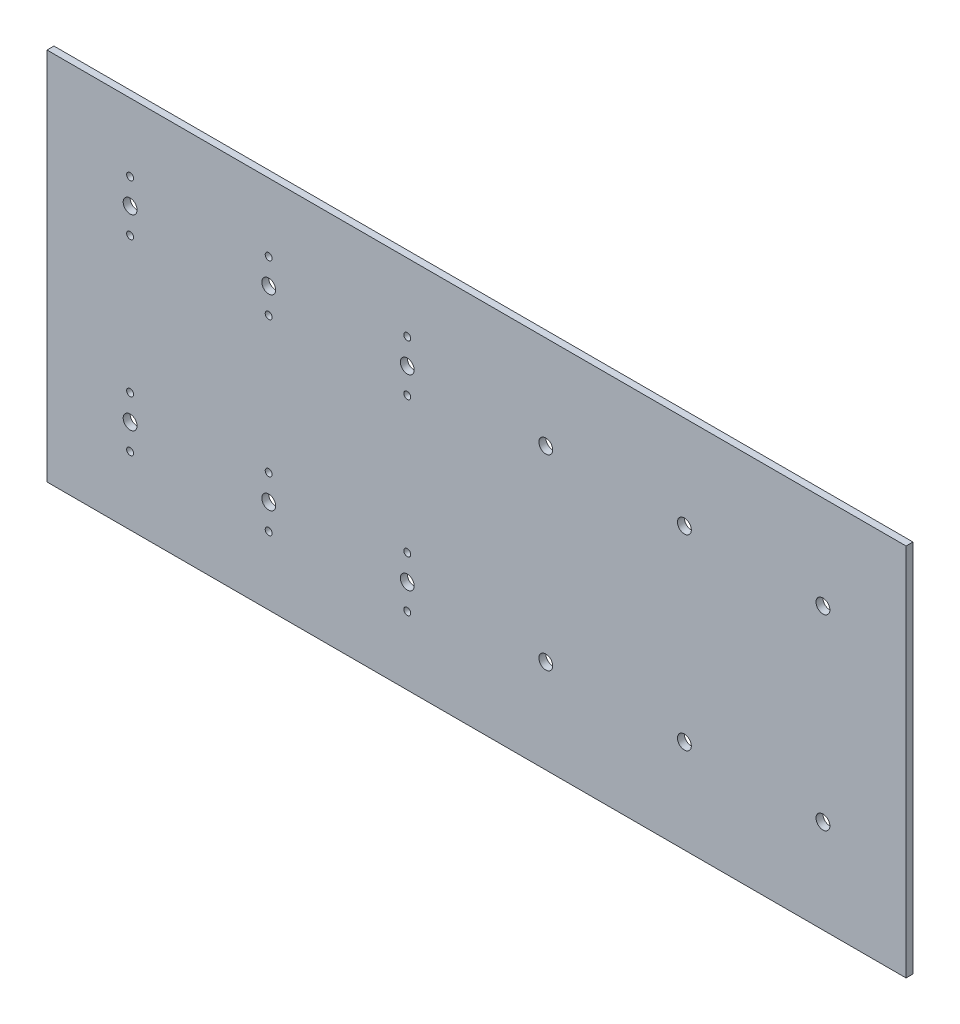
ISO-10303-21;
HEADER;
FILE_DESCRIPTION(('STEP AP214'),'2;1');
FILE_NAME('part.step','',(''),(''),'','','');
FILE_SCHEMA(('AUTOMOTIVE_DESIGN { 1 0 10303 214 1 1 1 1 }'));
ENDSEC;
DATA;
#1=APPLICATION_CONTEXT('core data for automotive mechanical design processes');
#2=APPLICATION_PROTOCOL_DEFINITION('international standard','automotive_design',2000,#1);
#3=PRODUCT_CONTEXT('',#1,'mechanical');
#4=PRODUCT('Part','Part','',(#3));
#5=PRODUCT_RELATED_PRODUCT_CATEGORY('part','',(#4));
#6=PRODUCT_DEFINITION_FORMATION('','',#4);
#7=PRODUCT_DEFINITION_CONTEXT('part definition',#1,'design');
#8=PRODUCT_DEFINITION('design','',#6,#7);
#9=PRODUCT_DEFINITION_SHAPE('','',#8);
#10=(LENGTH_UNIT() NAMED_UNIT(*) SI_UNIT(.MILLI.,.METRE.));
#11=(NAMED_UNIT(*) PLANE_ANGLE_UNIT() SI_UNIT($,.RADIAN.));
#12=(NAMED_UNIT(*) SI_UNIT($,.STERADIAN.) SOLID_ANGLE_UNIT());
#13=UNCERTAINTY_MEASURE_WITH_UNIT(LENGTH_MEASURE(1.E-05),#10,'distance_accuracy_value','');
#14=(GEOMETRIC_REPRESENTATION_CONTEXT(3) GLOBAL_UNCERTAINTY_ASSIGNED_CONTEXT((#13)) GLOBAL_UNIT_ASSIGNED_CONTEXT((#10,
#11,#12)) REPRESENTATION_CONTEXT('',''));
#15=CARTESIAN_POINT('',(0.,0.,0.));
#16=DIRECTION('',(0.,0.,1.));
#17=DIRECTION('',(1.,0.,0.));
#18=AXIS2_PLACEMENT_3D('',#15,#16,#17);
#19=CARTESIAN_POINT('',(-10.,10.0000000000001,5.));
#20=DIRECTION('',(1.,0.,0.));
#21=DIRECTION('',(0.,1.,0.));
#22=AXIS2_PLACEMENT_3D('',#19,#20,#21);
#23=PLANE('',#22);
#24=DIRECTION('',(0.,-1.,0.));
#25=VECTOR('',#24,1.);
#26=CARTESIAN_POINT('',(-10.,10.0000000000001,0.));
#27=LINE('',#26,#25);
#28=CARTESIAN_POINT('',(-10.,10.0000000000001,0.));
#29=VERTEX_POINT('',#28);
#30=CARTESIAN_POINT('',(-9.99999999999995,-260.,0.));
#31=VERTEX_POINT('',#30);
#32=EDGE_CURVE('E107',#29,#31,#27,.T.);
#33=ORIENTED_EDGE('',*,*,#32,.T.);
#34=DIRECTION('',(0.,0.,-1.));
#35=VECTOR('',#34,1.);
#36=CARTESIAN_POINT('',(-9.99999999999995,-260.,5.));
#37=LINE('',#36,#35);
#38=CARTESIAN_POINT('',(-9.99999999999995,-260.,5.));
#39=VERTEX_POINT('',#38);
#40=EDGE_CURVE('E11',#39,#31,#37,.T.);
#41=ORIENTED_EDGE('',*,*,#40,.F.);
#42=DIRECTION('',(0.,-1.,0.));
#43=VECTOR('',#42,1.);
#44=CARTESIAN_POINT('',(-10.,10.0000000000001,5.));
#45=LINE('',#44,#43);
#46=CARTESIAN_POINT('',(-10.,10.0000000000001,5.));
#47=VERTEX_POINT('',#46);
#48=EDGE_CURVE('E91',#47,#39,#45,.T.);
#49=ORIENTED_EDGE('',*,*,#48,.F.);
#50=DIRECTION('',(0.,0.,-1.));
#51=VECTOR('',#50,1.);
#52=CARTESIAN_POINT('',(-10.,10.0000000000001,5.));
#53=LINE('',#52,#51);
#54=EDGE_CURVE('E103',#47,#29,#53,.T.);
#55=ORIENTED_EDGE('',*,*,#54,.T.);
#56=EDGE_LOOP('',(#33,#41,#49,#55));
#57=FACE_BOUND('',#56,.T.);
#58=ADVANCED_FACE('F39',(#57),#23,.F.);
#59=CARTESIAN_POINT('',(-9.99999999999995,-260.,5.));
#60=DIRECTION('',(0.,1.,0.));
#61=DIRECTION('',(0.,0.,1.));
#62=AXIS2_PLACEMENT_3D('',#59,#60,#61);
#63=PLANE('',#62);
#64=DIRECTION('',(1.,0.,0.));
#65=VECTOR('',#64,1.);
#66=CARTESIAN_POINT('',(-9.99999999999995,-260.,0.));
#67=LINE('',#66,#65);
#68=CARTESIAN_POINT('',(610.,-260.,0.));
#69=VERTEX_POINT('',#68);
#70=EDGE_CURVE('E96',#31,#69,#67,.T.);
#71=ORIENTED_EDGE('',*,*,#70,.T.);
#72=DIRECTION('',(0.,0.,-1.));
#73=VECTOR('',#72,1.);
#74=CARTESIAN_POINT('',(610.,-260.,5.));
#75=LINE('',#74,#73);
#76=CARTESIAN_POINT('',(610.,-260.,5.));
#77=VERTEX_POINT('',#76);
#78=EDGE_CURVE('E48',#77,#69,#75,.T.);
#79=ORIENTED_EDGE('',*,*,#78,.F.);
#80=DIRECTION('',(1.,0.,0.));
#81=VECTOR('',#80,1.);
#82=CARTESIAN_POINT('',(-9.99999999999995,-260.,5.));
#83=LINE('',#82,#81);
#84=EDGE_CURVE('E86',#39,#77,#83,.T.);
#85=ORIENTED_EDGE('',*,*,#84,.F.);
#86=ORIENTED_EDGE('',*,*,#40,.T.);
#87=EDGE_LOOP('',(#71,#79,#85,#86));
#88=FACE_BOUND('',#87,.T.);
#89=ADVANCED_FACE('F95',(#88),#63,.F.);
#90=CARTESIAN_POINT('',(610.,10.0000000000001,5.));
#91=DIRECTION('',(-1.,0.,0.));
#92=DIRECTION('',(0.,0.,1.));
#93=AXIS2_PLACEMENT_3D('',#90,#91,#92);
#94=PLANE('',#93);
#95=DIRECTION('',(0.,1.,0.));
#96=VECTOR('',#95,1.);
#97=CARTESIAN_POINT('',(610.,10.0000000000001,0.));
#98=LINE('',#97,#96);
#99=CARTESIAN_POINT('',(610.,10.0000000000001,0.));
#100=VERTEX_POINT('',#99);
#101=EDGE_CURVE('E73',#69,#100,#98,.T.);
#102=ORIENTED_EDGE('',*,*,#101,.T.);
#103=DIRECTION('',(0.,0.,-1.));
#104=VECTOR('',#103,1.);
#105=CARTESIAN_POINT('',(610.,10.0000000000001,5.));
#106=LINE('',#105,#104);
#107=CARTESIAN_POINT('',(610.,10.0000000000001,5.));
#108=VERTEX_POINT('',#107);
#109=EDGE_CURVE('E98',#108,#100,#106,.T.);
#110=ORIENTED_EDGE('',*,*,#109,.F.);
#111=DIRECTION('',(0.,1.,0.));
#112=VECTOR('',#111,1.);
#113=CARTESIAN_POINT('',(610.,10.0000000000001,5.));
#114=LINE('',#113,#112);
#115=EDGE_CURVE('E89',#77,#108,#114,.T.);
#116=ORIENTED_EDGE('',*,*,#115,.F.);
#117=ORIENTED_EDGE('',*,*,#78,.T.);
#118=EDGE_LOOP('',(#102,#110,#116,#117));
#119=FACE_BOUND('',#118,.T.);
#120=ADVANCED_FACE('F99',(#119),#94,.F.);
#121=CARTESIAN_POINT('',(-10.,10.0000000000001,5.));
#122=DIRECTION('',(0.,-1.,0.));
#123=DIRECTION('',(1.,0.,0.));
#124=AXIS2_PLACEMENT_3D('',#121,#122,#123);
#125=PLANE('',#124);
#126=DIRECTION('',(-1.,0.,0.));
#127=VECTOR('',#126,1.);
#128=CARTESIAN_POINT('',(-10.,10.0000000000001,0.));
#129=LINE('',#128,#127);
#130=EDGE_CURVE('E79',#100,#29,#129,.T.);
#131=ORIENTED_EDGE('',*,*,#130,.T.);
#132=ORIENTED_EDGE('',*,*,#54,.F.);
#133=DIRECTION('',(-1.,0.,0.));
#134=VECTOR('',#133,1.);
#135=CARTESIAN_POINT('',(-10.,10.0000000000001,5.));
#136=LINE('',#135,#134);
#137=EDGE_CURVE('E56',#108,#47,#136,.T.);
#138=ORIENTED_EDGE('',*,*,#137,.F.);
#139=ORIENTED_EDGE('',*,*,#109,.T.);
#140=EDGE_LOOP('',(#131,#132,#138,#139));
#141=FACE_BOUND('',#140,.T.);
#142=ADVANCED_FACE('F121',(#141),#125,.F.);
#143=CARTESIAN_POINT('',(0.,0.,5.));
#144=DIRECTION('',(0.,0.,1.));
#145=DIRECTION('',(1.,0.,0.));
#146=AXIS2_PLACEMENT_3D('',#143,#144,#145);
#147=PLANE('',#146);
#148=CARTESIAN_POINT('',(350.,-57.4999999999998,5.));
#149=DIRECTION('',(0.,0.,-1.));
#150=DIRECTION('',(-1.,0.,0.));
#151=AXIS2_PLACEMENT_3D('',#148,#149,#150);
#152=CIRCLE('',#151,5.00000000000005);
#153=CARTESIAN_POINT('',(345.,-57.4999999999998,5.));
#154=VERTEX_POINT('',#153);
#155=EDGE_CURVE('E141',#154,#154,#152,.T.);
#156=ORIENTED_EDGE('',*,*,#155,.T.);
#157=EDGE_LOOP('',(#156));
#158=FACE_BOUND('',#157,.T.);
#159=CARTESIAN_POINT('',(250.,-57.4999999999998,5.));
#160=DIRECTION('',(0.,0.,-1.));
#161=DIRECTION('',(1.,0.,0.));
#162=AXIS2_PLACEMENT_3D('',#159,#160,#161);
#163=CIRCLE('',#162,4.99999999999999);
#164=CARTESIAN_POINT('',(255.,-57.4999999999998,5.));
#165=VERTEX_POINT('',#164);
#166=EDGE_CURVE('E221',#165,#165,#163,.T.);
#167=ORIENTED_EDGE('',*,*,#166,.T.);
#168=EDGE_LOOP('',(#167));
#169=FACE_BOUND('',#168,.T.);
#170=CARTESIAN_POINT('',(150.,-57.4999999999998,5.));
#171=DIRECTION('',(0.,0.,-1.));
#172=DIRECTION('',(1.,0.,0.));
#173=AXIS2_PLACEMENT_3D('',#170,#171,#172);
#174=CIRCLE('',#173,5.00000000000002);
#175=CARTESIAN_POINT('',(155.,-57.4999999999998,5.));
#176=VERTEX_POINT('',#175);
#177=EDGE_CURVE('E213',#176,#176,#174,.T.);
#178=ORIENTED_EDGE('',*,*,#177,.T.);
#179=EDGE_LOOP('',(#178));
#180=FACE_BOUND('',#179,.T.);
#181=CARTESIAN_POINT('',(49.9999999999998,-57.4999999999998,5.));
#182=DIRECTION('',(0.,0.,-1.));
#183=DIRECTION('',(1.,0.,0.));
#184=AXIS2_PLACEMENT_3D('',#181,#182,#183);
#185=CIRCLE('',#184,5.00000000000002);
#186=CARTESIAN_POINT('',(54.9999999999998,-57.4999999999998,5.));
#187=VERTEX_POINT('',#186);
#188=EDGE_CURVE('E204',#187,#187,#185,.T.);
#189=ORIENTED_EDGE('',*,*,#188,.T.);
#190=EDGE_LOOP('',(#189));
#191=FACE_BOUND('',#190,.T.);
#192=CARTESIAN_POINT('',(250.,-210.9,5.));
#193=DIRECTION('',(0.,0.,-1.));
#194=DIRECTION('',(1.,0.,0.));
#195=AXIS2_PLACEMENT_3D('',#192,#193,#194);
#196=CIRCLE('',#195,2.50000000000002);
#197=CARTESIAN_POINT('',(252.5,-210.9,5.));
#198=VERTEX_POINT('',#197);
#199=EDGE_CURVE('E252',#198,#198,#196,.T.);
#200=ORIENTED_EDGE('',*,*,#199,.T.);
#201=EDGE_LOOP('',(#200));
#202=FACE_BOUND('',#201,.T.);
#203=CARTESIAN_POINT('',(49.9999999999998,-174.1,5.));
#204=DIRECTION('',(0.,0.,-1.));
#205=DIRECTION('',(1.,0.,0.));
#206=AXIS2_PLACEMENT_3D('',#203,#204,#205);
#207=CIRCLE('',#206,2.5);
#208=CARTESIAN_POINT('',(52.4999999999998,-174.1,5.));
#209=VERTEX_POINT('',#208);
#210=EDGE_CURVE('E237',#209,#209,#207,.T.);
#211=ORIENTED_EDGE('',*,*,#210,.T.);
#212=EDGE_LOOP('',(#211));
#213=FACE_BOUND('',#212,.T.);
#214=CARTESIAN_POINT('',(49.9999999999998,-210.9,5.));
#215=DIRECTION('',(0.,0.,-1.));
#216=DIRECTION('',(-1.,0.,0.));
#217=AXIS2_PLACEMENT_3D('',#214,#215,#216);
#218=CIRCLE('',#217,2.5);
#219=CARTESIAN_POINT('',(47.4999999999998,-210.9,5.));
#220=VERTEX_POINT('',#219);
#221=EDGE_CURVE('E236',#220,#220,#218,.T.);
#222=ORIENTED_EDGE('',*,*,#221,.T.);
#223=EDGE_LOOP('',(#222));
#224=FACE_BOUND('',#223,.T.);
#225=CARTESIAN_POINT('',(49.9999999999998,-39.0999999999999,5.));
#226=DIRECTION('',(0.,0.,-1.));
#227=DIRECTION('',(1.,0.,0.));
#228=AXIS2_PLACEMENT_3D('',#225,#226,#227);
#229=CIRCLE('',#228,2.5);
#230=CARTESIAN_POINT('',(52.4999999999998,-39.0999999999999,5.));
#231=VERTEX_POINT('',#230);
#232=EDGE_CURVE('E205',#231,#231,#229,.T.);
#233=ORIENTED_EDGE('',*,*,#232,.T.);
#234=EDGE_LOOP('',(#233));
#235=FACE_BOUND('',#234,.T.);
#236=CARTESIAN_POINT('',(450.,-57.4999999999999,5.));
#237=DIRECTION('',(0.,0.,-1.));
#238=DIRECTION('',(-1.,0.,0.));
#239=AXIS2_PLACEMENT_3D('',#236,#237,#238);
#240=CIRCLE('',#239,5.00000000000005);
#241=CARTESIAN_POINT('',(445.,-57.4999999999999,5.));
#242=VERTEX_POINT('',#241);
#243=EDGE_CURVE('E140',#242,#242,#240,.T.);
#244=ORIENTED_EDGE('',*,*,#243,.T.);
#245=EDGE_LOOP('',(#244));
#246=FACE_BOUND('',#245,.T.);
#247=CARTESIAN_POINT('',(550.,-57.4999999999999,5.));
#248=DIRECTION('',(0.,0.,-1.));
#249=DIRECTION('',(-1.,0.,0.));
#250=AXIS2_PLACEMENT_3D('',#247,#248,#249);
#251=CIRCLE('',#250,4.99999999999993);
#252=CARTESIAN_POINT('',(545.,-57.4999999999999,5.));
#253=VERTEX_POINT('',#252);
#254=EDGE_CURVE('E149',#253,#253,#251,.T.);
#255=ORIENTED_EDGE('',*,*,#254,.T.);
#256=EDGE_LOOP('',(#255));
#257=FACE_BOUND('',#256,.T.);
#258=CARTESIAN_POINT('',(550.,-192.5,5.));
#259=DIRECTION('',(0.,0.,-1.));
#260=DIRECTION('',(1.,0.,0.));
#261=AXIS2_PLACEMENT_3D('',#258,#259,#260);
#262=CIRCLE('',#261,4.99999999999993);
#263=CARTESIAN_POINT('',(555.,-192.5,5.));
#264=VERTEX_POINT('',#263);
#265=EDGE_CURVE('E157',#264,#264,#262,.T.);
#266=ORIENTED_EDGE('',*,*,#265,.T.);
#267=EDGE_LOOP('',(#266));
#268=FACE_BOUND('',#267,.T.);
#269=CARTESIAN_POINT('',(450.,-192.5,5.));
#270=DIRECTION('',(0.,0.,-1.));
#271=DIRECTION('',(1.,0.,0.));
#272=AXIS2_PLACEMENT_3D('',#269,#270,#271);
#273=CIRCLE('',#272,5.00000000000005);
#274=CARTESIAN_POINT('',(455.,-192.5,5.));
#275=VERTEX_POINT('',#274);
#276=EDGE_CURVE('E165',#275,#275,#273,.T.);
#277=ORIENTED_EDGE('',*,*,#276,.T.);
#278=EDGE_LOOP('',(#277));
#279=FACE_BOUND('',#278,.T.);
#280=CARTESIAN_POINT('',(150.,-192.5,5.));
#281=DIRECTION('',(0.,0.,-1.));
#282=DIRECTION('',(-1.,0.,0.));
#283=AXIS2_PLACEMENT_3D('',#280,#281,#282);
#284=CIRCLE('',#283,5.00000000000002);
#285=CARTESIAN_POINT('',(145.,-192.5,5.));
#286=VERTEX_POINT('',#285);
#287=EDGE_CURVE('E132',#286,#286,#284,.T.);
#288=ORIENTED_EDGE('',*,*,#287,.T.);
#289=EDGE_LOOP('',(#288));
#290=FACE_BOUND('',#289,.T.);
#291=CARTESIAN_POINT('',(250.,-192.5,5.));
#292=DIRECTION('',(0.,0.,-1.));
#293=DIRECTION('',(-1.,0.,0.));
#294=AXIS2_PLACEMENT_3D('',#291,#292,#293);
#295=CIRCLE('',#294,4.99999999999999);
#296=CARTESIAN_POINT('',(245.,-192.5,5.));
#297=VERTEX_POINT('',#296);
#298=EDGE_CURVE('E174',#297,#297,#295,.T.);
#299=ORIENTED_EDGE('',*,*,#298,.T.);
#300=EDGE_LOOP('',(#299));
#301=FACE_BOUND('',#300,.T.);
#302=CARTESIAN_POINT('',(49.9999999999998,-75.8999999999998,5.));
#303=DIRECTION('',(0.,0.,-1.));
#304=DIRECTION('',(-1.,0.,0.));
#305=AXIS2_PLACEMENT_3D('',#302,#303,#304);
#306=CIRCLE('',#305,2.5);
#307=CARTESIAN_POINT('',(47.4999999999998,-75.8999999999998,5.));
#308=VERTEX_POINT('',#307);
#309=EDGE_CURVE('E175',#308,#308,#306,.T.);
#310=ORIENTED_EDGE('',*,*,#309,.T.);
#311=EDGE_LOOP('',(#310));
#312=FACE_BOUND('',#311,.T.);
#313=CARTESIAN_POINT('',(350.,-192.5,5.));
#314=DIRECTION('',(0.,0.,-1.));
#315=DIRECTION('',(1.,0.,0.));
#316=AXIS2_PLACEMENT_3D('',#313,#314,#315);
#317=CIRCLE('',#316,5.00000000000005);
#318=CARTESIAN_POINT('',(355.,-192.5,5.));
#319=VERTEX_POINT('',#318);
#320=EDGE_CURVE('E189',#319,#319,#317,.T.);
#321=ORIENTED_EDGE('',*,*,#320,.T.);
#322=EDGE_LOOP('',(#321));
#323=FACE_BOUND('',#322,.T.);
#324=CARTESIAN_POINT('',(150.,-39.0999999999999,5.));
#325=DIRECTION('',(0.,0.,-1.));
#326=DIRECTION('',(-1.,0.,0.));
#327=AXIS2_PLACEMENT_3D('',#324,#325,#326);
#328=CIRCLE('',#327,2.5);
#329=CARTESIAN_POINT('',(147.5,-39.0999999999999,5.));
#330=VERTEX_POINT('',#329);
#331=EDGE_CURVE('E285',#330,#330,#328,.T.);
#332=ORIENTED_EDGE('',*,*,#331,.T.);
#333=EDGE_LOOP('',(#332));
#334=FACE_BOUND('',#333,.T.);
#335=CARTESIAN_POINT('',(150.,-210.9,5.));
#336=DIRECTION('',(0.,0.,-1.));
#337=DIRECTION('',(1.,0.,0.));
#338=AXIS2_PLACEMENT_3D('',#335,#336,#337);
#339=CIRCLE('',#338,2.5);
#340=CARTESIAN_POINT('',(152.5,-210.9,5.));
#341=VERTEX_POINT('',#340);
#342=EDGE_CURVE('E300',#341,#341,#339,.T.);
#343=ORIENTED_EDGE('',*,*,#342,.T.);
#344=EDGE_LOOP('',(#343));
#345=FACE_BOUND('',#344,.T.);
#346=CARTESIAN_POINT('',(150.,-174.1,5.));
#347=DIRECTION('',(0.,0.,-1.));
#348=DIRECTION('',(-1.,0.,0.));
#349=AXIS2_PLACEMENT_3D('',#346,#347,#348);
#350=CIRCLE('',#349,2.5);
#351=CARTESIAN_POINT('',(147.5,-174.1,5.));
#352=VERTEX_POINT('',#351);
#353=EDGE_CURVE('E301',#352,#352,#350,.T.);
#354=ORIENTED_EDGE('',*,*,#353,.T.);
#355=EDGE_LOOP('',(#354));
#356=FACE_BOUND('',#355,.T.);
#357=CARTESIAN_POINT('',(250.,-174.1,5.));
#358=DIRECTION('',(0.,0.,-1.));
#359=DIRECTION('',(-1.,0.,0.));
#360=AXIS2_PLACEMENT_3D('',#357,#358,#359);
#361=CIRCLE('',#360,2.50000000000002);
#362=CARTESIAN_POINT('',(247.5,-174.1,5.));
#363=VERTEX_POINT('',#362);
#364=EDGE_CURVE('E253',#363,#363,#361,.T.);
#365=ORIENTED_EDGE('',*,*,#364,.T.);
#366=EDGE_LOOP('',(#365));
#367=FACE_BOUND('',#366,.T.);
#368=CARTESIAN_POINT('',(250.,-75.8999999999998,5.));
#369=DIRECTION('',(0.,0.,-1.));
#370=DIRECTION('',(1.,0.,0.));
#371=AXIS2_PLACEMENT_3D('',#368,#369,#370);
#372=CIRCLE('',#371,2.50000000000002);
#373=CARTESIAN_POINT('',(252.5,-75.8999999999998,5.));
#374=VERTEX_POINT('',#373);
#375=EDGE_CURVE('E268',#374,#374,#372,.T.);
#376=ORIENTED_EDGE('',*,*,#375,.T.);
#377=EDGE_LOOP('',(#376));
#378=FACE_BOUND('',#377,.T.);
#379=CARTESIAN_POINT('',(250.,-39.0999999999999,5.));
#380=DIRECTION('',(0.,0.,-1.));
#381=DIRECTION('',(-1.,0.,0.));
#382=AXIS2_PLACEMENT_3D('',#379,#380,#381);
#383=CIRCLE('',#382,2.50000000000002);
#384=CARTESIAN_POINT('',(247.5,-39.0999999999999,5.));
#385=VERTEX_POINT('',#384);
#386=EDGE_CURVE('E269',#385,#385,#383,.T.);
#387=ORIENTED_EDGE('',*,*,#386,.T.);
#388=EDGE_LOOP('',(#387));
#389=FACE_BOUND('',#388,.T.);
#390=CARTESIAN_POINT('',(150.,-75.8999999999998,5.));
#391=DIRECTION('',(0.,0.,-1.));
#392=DIRECTION('',(1.,0.,0.));
#393=AXIS2_PLACEMENT_3D('',#390,#391,#392);
#394=CIRCLE('',#393,2.5);
#395=CARTESIAN_POINT('',(152.5,-75.8999999999998,5.));
#396=VERTEX_POINT('',#395);
#397=EDGE_CURVE('E284',#396,#396,#394,.T.);
#398=ORIENTED_EDGE('',*,*,#397,.T.);
#399=EDGE_LOOP('',(#398));
#400=FACE_BOUND('',#399,.T.);
#401=CARTESIAN_POINT('',(49.9999999999998,-192.5,5.));
#402=DIRECTION('',(0.,0.,-1.));
#403=DIRECTION('',(-1.,0.,0.));
#404=AXIS2_PLACEMENT_3D('',#401,#402,#403);
#405=CIRCLE('',#404,4.99999999999999);
#406=CARTESIAN_POINT('',(44.9999999999998,-192.5,5.));
#407=VERTEX_POINT('',#406);
#408=EDGE_CURVE('E111',#407,#407,#405,.T.);
#409=ORIENTED_EDGE('',*,*,#408,.T.);
#410=EDGE_LOOP('',(#409));
#411=FACE_BOUND('',#410,.T.);
#412=ORIENTED_EDGE('',*,*,#48,.T.);
#413=ORIENTED_EDGE('',*,*,#84,.T.);
#414=ORIENTED_EDGE('',*,*,#115,.T.);
#415=ORIENTED_EDGE('',*,*,#137,.T.);
#416=EDGE_LOOP('',(#412,#413,#414,#415));
#417=FACE_BOUND('',#416,.T.);
#418=ADVANCED_FACE('F87',(#158,#169,#180,#191,#202,#213,#224,#235,#246,#257,#268,#279,#290,#301,
#312,#323,#334,#345,#356,#367,#378,#389,#400,#411,#417),#147,.T.);
#419=CARTESIAN_POINT('',(0.,0.,0.));
#420=DIRECTION('',(0.,0.,1.));
#421=DIRECTION('',(1.,0.,0.));
#422=AXIS2_PLACEMENT_3D('',#419,#420,#421);
#423=PLANE('',#422);
#424=CARTESIAN_POINT('',(350.,-57.4999999999998,0.));
#425=DIRECTION('',(0.,0.,-1.));
#426=DIRECTION('',(-1.,0.,0.));
#427=AXIS2_PLACEMENT_3D('',#424,#425,#426);
#428=CIRCLE('',#427,5.00000000000005);
#429=CARTESIAN_POINT('',(345.,-57.4999999999998,0.));
#430=VERTEX_POINT('',#429);
#431=EDGE_CURVE('E225',#430,#430,#428,.T.);
#432=ORIENTED_EDGE('',*,*,#431,.F.);
#433=EDGE_LOOP('',(#432));
#434=FACE_BOUND('',#433,.T.);
#435=CARTESIAN_POINT('',(250.,-57.4999999999998,0.));
#436=DIRECTION('',(0.,0.,-1.));
#437=DIRECTION('',(1.,0.,0.));
#438=AXIS2_PLACEMENT_3D('',#435,#436,#437);
#439=CIRCLE('',#438,4.99999999999999);
#440=CARTESIAN_POINT('',(255.,-57.4999999999998,0.));
#441=VERTEX_POINT('',#440);
#442=EDGE_CURVE('E217',#441,#441,#439,.T.);
#443=ORIENTED_EDGE('',*,*,#442,.F.);
#444=EDGE_LOOP('',(#443));
#445=FACE_BOUND('',#444,.T.);
#446=CARTESIAN_POINT('',(150.,-57.4999999999998,0.));
#447=DIRECTION('',(0.,0.,-1.));
#448=DIRECTION('',(1.,0.,0.));
#449=AXIS2_PLACEMENT_3D('',#446,#447,#448);
#450=CIRCLE('',#449,5.00000000000002);
#451=CARTESIAN_POINT('',(155.,-57.4999999999998,0.));
#452=VERTEX_POINT('',#451);
#453=EDGE_CURVE('E209',#452,#452,#450,.T.);
#454=ORIENTED_EDGE('',*,*,#453,.F.);
#455=EDGE_LOOP('',(#454));
#456=FACE_BOUND('',#455,.T.);
#457=CARTESIAN_POINT('',(49.9999999999998,-57.4999999999998,0.));
#458=DIRECTION('',(0.,0.,-1.));
#459=DIRECTION('',(1.,0.,0.));
#460=AXIS2_PLACEMENT_3D('',#457,#458,#459);
#461=CIRCLE('',#460,5.00000000000002);
#462=CARTESIAN_POINT('',(54.9999999999998,-57.4999999999998,0.));
#463=VERTEX_POINT('',#462);
#464=EDGE_CURVE('E200',#463,#463,#461,.T.);
#465=ORIENTED_EDGE('',*,*,#464,.F.);
#466=EDGE_LOOP('',(#465));
#467=FACE_BOUND('',#466,.T.);
#468=CARTESIAN_POINT('',(250.,-210.9,0.));
#469=DIRECTION('',(0.,0.,-1.));
#470=DIRECTION('',(1.,0.,0.));
#471=AXIS2_PLACEMENT_3D('',#468,#469,#470);
#472=CIRCLE('',#471,2.50000000000002);
#473=CARTESIAN_POINT('',(252.5,-210.9,0.));
#474=VERTEX_POINT('',#473);
#475=EDGE_CURVE('E248',#474,#474,#472,.T.);
#476=ORIENTED_EDGE('',*,*,#475,.F.);
#477=EDGE_LOOP('',(#476));
#478=FACE_BOUND('',#477,.T.);
#479=CARTESIAN_POINT('',(49.9999999999998,-174.1,0.));
#480=DIRECTION('',(0.,0.,-1.));
#481=DIRECTION('',(1.,0.,0.));
#482=AXIS2_PLACEMENT_3D('',#479,#480,#481);
#483=CIRCLE('',#482,2.5);
#484=CARTESIAN_POINT('',(52.4999999999998,-174.1,0.));
#485=VERTEX_POINT('',#484);
#486=EDGE_CURVE('E257',#485,#485,#483,.T.);
#487=ORIENTED_EDGE('',*,*,#486,.F.);
#488=EDGE_LOOP('',(#487));
#489=FACE_BOUND('',#488,.T.);
#490=CARTESIAN_POINT('',(49.9999999999998,-210.9,0.));
#491=DIRECTION('',(0.,0.,-1.));
#492=DIRECTION('',(-1.,0.,0.));
#493=AXIS2_PLACEMENT_3D('',#490,#491,#492);
#494=CIRCLE('',#493,2.5);
#495=CARTESIAN_POINT('',(47.4999999999998,-210.9,0.));
#496=VERTEX_POINT('',#495);
#497=EDGE_CURVE('E232',#496,#496,#494,.T.);
#498=ORIENTED_EDGE('',*,*,#497,.F.);
#499=EDGE_LOOP('',(#498));
#500=FACE_BOUND('',#499,.T.);
#501=CARTESIAN_POINT('',(49.9999999999998,-39.0999999999999,0.));
#502=DIRECTION('',(0.,0.,-1.));
#503=DIRECTION('',(1.,0.,0.));
#504=AXIS2_PLACEMENT_3D('',#501,#502,#503);
#505=CIRCLE('',#504,2.5);
#506=CARTESIAN_POINT('',(52.4999999999998,-39.0999999999999,0.));
#507=VERTEX_POINT('',#506);
#508=EDGE_CURVE('E241',#507,#507,#505,.T.);
#509=ORIENTED_EDGE('',*,*,#508,.F.);
#510=EDGE_LOOP('',(#509));
#511=FACE_BOUND('',#510,.T.);
#512=CARTESIAN_POINT('',(450.,-57.4999999999999,0.));
#513=DIRECTION('',(0.,0.,-1.));
#514=DIRECTION('',(-1.,0.,0.));
#515=AXIS2_PLACEMENT_3D('',#512,#513,#514);
#516=CIRCLE('',#515,5.00000000000005);
#517=CARTESIAN_POINT('',(445.,-57.4999999999999,0.));
#518=VERTEX_POINT('',#517);
#519=EDGE_CURVE('E136',#518,#518,#516,.T.);
#520=ORIENTED_EDGE('',*,*,#519,.F.);
#521=EDGE_LOOP('',(#520));
#522=FACE_BOUND('',#521,.T.);
#523=CARTESIAN_POINT('',(550.,-57.4999999999999,0.));
#524=DIRECTION('',(0.,0.,-1.));
#525=DIRECTION('',(-1.,0.,0.));
#526=AXIS2_PLACEMENT_3D('',#523,#524,#525);
#527=CIRCLE('',#526,4.99999999999993);
#528=CARTESIAN_POINT('',(545.,-57.4999999999999,0.));
#529=VERTEX_POINT('',#528);
#530=EDGE_CURVE('E145',#529,#529,#527,.T.);
#531=ORIENTED_EDGE('',*,*,#530,.F.);
#532=EDGE_LOOP('',(#531));
#533=FACE_BOUND('',#532,.T.);
#534=CARTESIAN_POINT('',(550.,-192.5,0.));
#535=DIRECTION('',(0.,0.,-1.));
#536=DIRECTION('',(1.,0.,0.));
#537=AXIS2_PLACEMENT_3D('',#534,#535,#536);
#538=CIRCLE('',#537,4.99999999999993);
#539=CARTESIAN_POINT('',(555.,-192.5,0.));
#540=VERTEX_POINT('',#539);
#541=EDGE_CURVE('E153',#540,#540,#538,.T.);
#542=ORIENTED_EDGE('',*,*,#541,.F.);
#543=EDGE_LOOP('',(#542));
#544=FACE_BOUND('',#543,.T.);
#545=CARTESIAN_POINT('',(450.,-192.5,0.));
#546=DIRECTION('',(0.,0.,-1.));
#547=DIRECTION('',(1.,0.,0.));
#548=AXIS2_PLACEMENT_3D('',#545,#546,#547);
#549=CIRCLE('',#548,5.00000000000005);
#550=CARTESIAN_POINT('',(455.,-192.5,0.));
#551=VERTEX_POINT('',#550);
#552=EDGE_CURVE('E161',#551,#551,#549,.T.);
#553=ORIENTED_EDGE('',*,*,#552,.F.);
#554=EDGE_LOOP('',(#553));
#555=FACE_BOUND('',#554,.T.);
#556=CARTESIAN_POINT('',(150.,-192.5,0.));
#557=DIRECTION('',(0.,0.,-1.));
#558=DIRECTION('',(-1.,0.,0.));
#559=AXIS2_PLACEMENT_3D('',#556,#557,#558);
#560=CIRCLE('',#559,5.00000000000002);
#561=CARTESIAN_POINT('',(145.,-192.5,0.));
#562=VERTEX_POINT('',#561);
#563=EDGE_CURVE('E179',#562,#562,#560,.T.);
#564=ORIENTED_EDGE('',*,*,#563,.F.);
#565=EDGE_LOOP('',(#564));
#566=FACE_BOUND('',#565,.T.);
#567=CARTESIAN_POINT('',(250.,-192.5,0.));
#568=DIRECTION('',(0.,0.,-1.));
#569=DIRECTION('',(-1.,0.,0.));
#570=AXIS2_PLACEMENT_3D('',#567,#568,#569);
#571=CIRCLE('',#570,4.99999999999999);
#572=CARTESIAN_POINT('',(245.,-192.5,0.));
#573=VERTEX_POINT('',#572);
#574=EDGE_CURVE('E170',#573,#573,#571,.T.);
#575=ORIENTED_EDGE('',*,*,#574,.F.);
#576=EDGE_LOOP('',(#575));
#577=FACE_BOUND('',#576,.T.);
#578=CARTESIAN_POINT('',(49.9999999999998,-75.8999999999998,0.));
#579=DIRECTION('',(0.,0.,-1.));
#580=DIRECTION('',(-1.,0.,0.));
#581=AXIS2_PLACEMENT_3D('',#578,#579,#580);
#582=CIRCLE('',#581,2.5);
#583=CARTESIAN_POINT('',(47.4999999999998,-75.8999999999998,0.));
#584=VERTEX_POINT('',#583);
#585=EDGE_CURVE('E193',#584,#584,#582,.T.);
#586=ORIENTED_EDGE('',*,*,#585,.F.);
#587=EDGE_LOOP('',(#586));
#588=FACE_BOUND('',#587,.T.);
#589=CARTESIAN_POINT('',(350.,-192.5,0.));
#590=DIRECTION('',(0.,0.,-1.));
#591=DIRECTION('',(1.,0.,0.));
#592=AXIS2_PLACEMENT_3D('',#589,#590,#591);
#593=CIRCLE('',#592,5.00000000000005);
#594=CARTESIAN_POINT('',(355.,-192.5,0.));
#595=VERTEX_POINT('',#594);
#596=EDGE_CURVE('E169',#595,#595,#593,.T.);
#597=ORIENTED_EDGE('',*,*,#596,.F.);
#598=EDGE_LOOP('',(#597));
#599=FACE_BOUND('',#598,.T.);
#600=CARTESIAN_POINT('',(150.,-39.0999999999999,0.));
#601=DIRECTION('',(0.,0.,-1.));
#602=DIRECTION('',(-1.,0.,0.));
#603=AXIS2_PLACEMENT_3D('',#600,#601,#602);
#604=CIRCLE('',#603,2.5);
#605=CARTESIAN_POINT('',(147.5,-39.0999999999999,0.));
#606=VERTEX_POINT('',#605);
#607=EDGE_CURVE('E305',#606,#606,#604,.T.);
#608=ORIENTED_EDGE('',*,*,#607,.F.);
#609=EDGE_LOOP('',(#608));
#610=FACE_BOUND('',#609,.T.);
#611=CARTESIAN_POINT('',(150.,-210.9,0.));
#612=DIRECTION('',(0.,0.,-1.));
#613=DIRECTION('',(1.,0.,0.));
#614=AXIS2_PLACEMENT_3D('',#611,#612,#613);
#615=CIRCLE('',#614,2.5);
#616=CARTESIAN_POINT('',(152.5,-210.9,0.));
#617=VERTEX_POINT('',#616);
#618=EDGE_CURVE('E296',#617,#617,#615,.T.);
#619=ORIENTED_EDGE('',*,*,#618,.F.);
#620=EDGE_LOOP('',(#619));
#621=FACE_BOUND('',#620,.T.);
#622=CARTESIAN_POINT('',(150.,-174.1,0.));
#623=DIRECTION('',(0.,0.,-1.));
#624=DIRECTION('',(-1.,0.,0.));
#625=AXIS2_PLACEMENT_3D('',#622,#623,#624);
#626=CIRCLE('',#625,2.5);
#627=CARTESIAN_POINT('',(147.5,-174.1,0.));
#628=VERTEX_POINT('',#627);
#629=EDGE_CURVE('E312',#628,#628,#626,.T.);
#630=ORIENTED_EDGE('',*,*,#629,.F.);
#631=EDGE_LOOP('',(#630));
#632=FACE_BOUND('',#631,.T.);
#633=CARTESIAN_POINT('',(250.,-174.1,0.));
#634=DIRECTION('',(0.,0.,-1.));
#635=DIRECTION('',(-1.,0.,0.));
#636=AXIS2_PLACEMENT_3D('',#633,#634,#635);
#637=CIRCLE('',#636,2.50000000000002);
#638=CARTESIAN_POINT('',(247.5,-174.1,0.));
#639=VERTEX_POINT('',#638);
#640=EDGE_CURVE('E273',#639,#639,#637,.T.);
#641=ORIENTED_EDGE('',*,*,#640,.F.);
#642=EDGE_LOOP('',(#641));
#643=FACE_BOUND('',#642,.T.);
#644=CARTESIAN_POINT('',(250.,-75.8999999999998,0.));
#645=DIRECTION('',(0.,0.,-1.));
#646=DIRECTION('',(1.,0.,0.));
#647=AXIS2_PLACEMENT_3D('',#644,#645,#646);
#648=CIRCLE('',#647,2.50000000000002);
#649=CARTESIAN_POINT('',(252.5,-75.8999999999998,0.));
#650=VERTEX_POINT('',#649);
#651=EDGE_CURVE('E264',#650,#650,#648,.T.);
#652=ORIENTED_EDGE('',*,*,#651,.F.);
#653=EDGE_LOOP('',(#652));
#654=FACE_BOUND('',#653,.T.);
#655=CARTESIAN_POINT('',(250.,-39.0999999999999,0.));
#656=DIRECTION('',(0.,0.,-1.));
#657=DIRECTION('',(-1.,0.,0.));
#658=AXIS2_PLACEMENT_3D('',#655,#656,#657);
#659=CIRCLE('',#658,2.50000000000002);
#660=CARTESIAN_POINT('',(247.5,-39.0999999999999,0.));
#661=VERTEX_POINT('',#660);
#662=EDGE_CURVE('E289',#661,#661,#659,.T.);
#663=ORIENTED_EDGE('',*,*,#662,.F.);
#664=EDGE_LOOP('',(#663));
#665=FACE_BOUND('',#664,.T.);
#666=CARTESIAN_POINT('',(150.,-75.8999999999998,0.));
#667=DIRECTION('',(0.,0.,-1.));
#668=DIRECTION('',(1.,0.,0.));
#669=AXIS2_PLACEMENT_3D('',#666,#667,#668);
#670=CIRCLE('',#669,2.5);
#671=CARTESIAN_POINT('',(152.5,-75.8999999999998,0.));
#672=VERTEX_POINT('',#671);
#673=EDGE_CURVE('E280',#672,#672,#670,.T.);
#674=ORIENTED_EDGE('',*,*,#673,.F.);
#675=EDGE_LOOP('',(#674));
#676=FACE_BOUND('',#675,.T.);
#677=CARTESIAN_POINT('',(49.9999999999998,-192.5,0.));
#678=DIRECTION('',(0.,0.,-1.));
#679=DIRECTION('',(-1.,0.,0.));
#680=AXIS2_PLACEMENT_3D('',#677,#678,#679);
#681=CIRCLE('',#680,4.99999999999999);
#682=CARTESIAN_POINT('',(44.9999999999998,-192.5,0.));
#683=VERTEX_POINT('',#682);
#684=EDGE_CURVE('E128',#683,#683,#681,.T.);
#685=ORIENTED_EDGE('',*,*,#684,.F.);
#686=EDGE_LOOP('',(#685));
#687=FACE_BOUND('',#686,.T.);
#688=ORIENTED_EDGE('',*,*,#32,.F.);
#689=ORIENTED_EDGE('',*,*,#130,.F.);
#690=ORIENTED_EDGE('',*,*,#101,.F.);
#691=ORIENTED_EDGE('',*,*,#70,.F.);
#692=EDGE_LOOP('',(#688,#689,#690,#691));
#693=FACE_BOUND('',#692,.T.);
#694=ADVANCED_FACE('F124',(#434,#445,#456,#467,#478,#489,#500,#511,#522,#533,#544,#555,#566,
#577,#588,#599,#610,#621,#632,#643,#654,#665,#676,#687,#693),#423,.F.);
#695=CARTESIAN_POINT('',(49.9999999999998,-192.5,5.));
#696=DIRECTION('',(0.,0.,-1.));
#697=DIRECTION('',(-1.,0.,0.));
#698=AXIS2_PLACEMENT_3D('',#695,#696,#697);
#699=CYLINDRICAL_SURFACE('',#698,4.99999999999999);
#700=ORIENTED_EDGE('',*,*,#408,.F.);
#701=EDGE_LOOP('',(#700));
#702=FACE_BOUND('',#701,.T.);
#703=ORIENTED_EDGE('',*,*,#684,.T.);
#704=EDGE_LOOP('',(#703));
#705=FACE_BOUND('',#704,.T.);
#706=ADVANCED_FACE('F332',(#702,#705),#699,.F.);
#707=CARTESIAN_POINT('',(150.,-75.8999999999998,5.));
#708=DIRECTION('',(0.,0.,-1.));
#709=DIRECTION('',(-1.,0.,0.));
#710=AXIS2_PLACEMENT_3D('',#707,#708,#709);
#711=CYLINDRICAL_SURFACE('',#710,2.5);
#712=ORIENTED_EDGE('',*,*,#397,.F.);
#713=EDGE_LOOP('',(#712));
#714=FACE_BOUND('',#713,.T.);
#715=ORIENTED_EDGE('',*,*,#673,.T.);
#716=EDGE_LOOP('',(#715));
#717=FACE_BOUND('',#716,.T.);
#718=ADVANCED_FACE('F346',(#714,#717),#711,.F.);
#719=CARTESIAN_POINT('',(250.,-39.0999999999999,5.));
#720=DIRECTION('',(0.,0.,-1.));
#721=DIRECTION('',(-1.,0.,0.));
#722=AXIS2_PLACEMENT_3D('',#719,#720,#721);
#723=CYLINDRICAL_SURFACE('',#722,2.50000000000002);
#724=ORIENTED_EDGE('',*,*,#386,.F.);
#725=EDGE_LOOP('',(#724));
#726=FACE_BOUND('',#725,.T.);
#727=ORIENTED_EDGE('',*,*,#662,.T.);
#728=EDGE_LOOP('',(#727));
#729=FACE_BOUND('',#728,.T.);
#730=ADVANCED_FACE('F352',(#726,#729),#723,.F.);
#731=CARTESIAN_POINT('',(250.,-75.8999999999998,5.));
#732=DIRECTION('',(0.,0.,-1.));
#733=DIRECTION('',(-1.,0.,0.));
#734=AXIS2_PLACEMENT_3D('',#731,#732,#733);
#735=CYLINDRICAL_SURFACE('',#734,2.50000000000002);
#736=ORIENTED_EDGE('',*,*,#375,.F.);
#737=EDGE_LOOP('',(#736));
#738=FACE_BOUND('',#737,.T.);
#739=ORIENTED_EDGE('',*,*,#651,.T.);
#740=EDGE_LOOP('',(#739));
#741=FACE_BOUND('',#740,.T.);
#742=ADVANCED_FACE('F422',(#738,#741),#735,.F.);
#743=CARTESIAN_POINT('',(250.,-174.1,5.));
#744=DIRECTION('',(0.,0.,-1.));
#745=DIRECTION('',(-1.,0.,0.));
#746=AXIS2_PLACEMENT_3D('',#743,#744,#745);
#747=CYLINDRICAL_SURFACE('',#746,2.50000000000002);
#748=ORIENTED_EDGE('',*,*,#364,.F.);
#749=EDGE_LOOP('',(#748));
#750=FACE_BOUND('',#749,.T.);
#751=ORIENTED_EDGE('',*,*,#640,.T.);
#752=EDGE_LOOP('',(#751));
#753=FACE_BOUND('',#752,.T.);
#754=ADVANCED_FACE('F326',(#750,#753),#747,.F.);
#755=CARTESIAN_POINT('',(150.,-174.1,5.));
#756=DIRECTION('',(0.,0.,-1.));
#757=DIRECTION('',(-1.,0.,0.));
#758=AXIS2_PLACEMENT_3D('',#755,#756,#757);
#759=CYLINDRICAL_SURFACE('',#758,2.5);
#760=ORIENTED_EDGE('',*,*,#353,.F.);
#761=EDGE_LOOP('',(#760));
#762=FACE_BOUND('',#761,.T.);
#763=ORIENTED_EDGE('',*,*,#629,.T.);
#764=EDGE_LOOP('',(#763));
#765=FACE_BOUND('',#764,.T.);
#766=ADVANCED_FACE('F322',(#762,#765),#759,.F.);
#767=CARTESIAN_POINT('',(150.,-210.9,5.));
#768=DIRECTION('',(0.,0.,-1.));
#769=DIRECTION('',(-1.,0.,0.));
#770=AXIS2_PLACEMENT_3D('',#767,#768,#769);
#771=CYLINDRICAL_SURFACE('',#770,2.5);
#772=ORIENTED_EDGE('',*,*,#342,.F.);
#773=EDGE_LOOP('',(#772));
#774=FACE_BOUND('',#773,.T.);
#775=ORIENTED_EDGE('',*,*,#618,.T.);
#776=EDGE_LOOP('',(#775));
#777=FACE_BOUND('',#776,.T.);
#778=ADVANCED_FACE('F325',(#774,#777),#771,.F.);
#779=CARTESIAN_POINT('',(150.,-39.0999999999999,5.));
#780=DIRECTION('',(0.,0.,-1.));
#781=DIRECTION('',(-1.,0.,0.));
#782=AXIS2_PLACEMENT_3D('',#779,#780,#781);
#783=CYLINDRICAL_SURFACE('',#782,2.5);
#784=ORIENTED_EDGE('',*,*,#331,.F.);
#785=EDGE_LOOP('',(#784));
#786=FACE_BOUND('',#785,.T.);
#787=ORIENTED_EDGE('',*,*,#607,.T.);
#788=EDGE_LOOP('',(#787));
#789=FACE_BOUND('',#788,.T.);
#790=ADVANCED_FACE('F410',(#786,#789),#783,.F.);
#791=CARTESIAN_POINT('',(350.,-192.5,5.));
#792=DIRECTION('',(0.,0.,-1.));
#793=DIRECTION('',(-1.,0.,0.));
#794=AXIS2_PLACEMENT_3D('',#791,#792,#793);
#795=CYLINDRICAL_SURFACE('',#794,5.00000000000005);
#796=ORIENTED_EDGE('',*,*,#320,.F.);
#797=EDGE_LOOP('',(#796));
#798=FACE_BOUND('',#797,.T.);
#799=ORIENTED_EDGE('',*,*,#596,.T.);
#800=EDGE_LOOP('',(#799));
#801=FACE_BOUND('',#800,.T.);
#802=ADVANCED_FACE('F417',(#798,#801),#795,.F.);
#803=CARTESIAN_POINT('',(49.9999999999998,-75.8999999999998,5.));
#804=DIRECTION('',(0.,0.,-1.));
#805=DIRECTION('',(-1.,0.,0.));
#806=AXIS2_PLACEMENT_3D('',#803,#804,#805);
#807=CYLINDRICAL_SURFACE('',#806,2.5);
#808=ORIENTED_EDGE('',*,*,#309,.F.);
#809=EDGE_LOOP('',(#808));
#810=FACE_BOUND('',#809,.T.);
#811=ORIENTED_EDGE('',*,*,#585,.T.);
#812=EDGE_LOOP('',(#811));
#813=FACE_BOUND('',#812,.T.);
#814=ADVANCED_FACE('F464',(#810,#813),#807,.F.);
#815=CARTESIAN_POINT('',(250.,-192.5,5.));
#816=DIRECTION('',(0.,0.,-1.));
#817=DIRECTION('',(-1.,0.,0.));
#818=AXIS2_PLACEMENT_3D('',#815,#816,#817);
#819=CYLINDRICAL_SURFACE('',#818,4.99999999999999);
#820=ORIENTED_EDGE('',*,*,#298,.F.);
#821=EDGE_LOOP('',(#820));
#822=FACE_BOUND('',#821,.T.);
#823=ORIENTED_EDGE('',*,*,#574,.T.);
#824=EDGE_LOOP('',(#823));
#825=FACE_BOUND('',#824,.T.);
#826=ADVANCED_FACE('F467',(#822,#825),#819,.F.);
#827=CARTESIAN_POINT('',(150.,-192.5,5.));
#828=DIRECTION('',(0.,0.,-1.));
#829=DIRECTION('',(-1.,0.,0.));
#830=AXIS2_PLACEMENT_3D('',#827,#828,#829);
#831=CYLINDRICAL_SURFACE('',#830,5.00000000000002);
#832=ORIENTED_EDGE('',*,*,#287,.F.);
#833=EDGE_LOOP('',(#832));
#834=FACE_BOUND('',#833,.T.);
#835=ORIENTED_EDGE('',*,*,#563,.T.);
#836=EDGE_LOOP('',(#835));
#837=FACE_BOUND('',#836,.T.);
#838=ADVANCED_FACE('F472',(#834,#837),#831,.F.);
#839=CARTESIAN_POINT('',(450.,-192.5,5.));
#840=DIRECTION('',(0.,0.,-1.));
#841=DIRECTION('',(-1.,0.,0.));
#842=AXIS2_PLACEMENT_3D('',#839,#840,#841);
#843=CYLINDRICAL_SURFACE('',#842,5.00000000000005);
#844=ORIENTED_EDGE('',*,*,#276,.F.);
#845=EDGE_LOOP('',(#844));
#846=FACE_BOUND('',#845,.T.);
#847=ORIENTED_EDGE('',*,*,#552,.T.);
#848=EDGE_LOOP('',(#847));
#849=FACE_BOUND('',#848,.T.);
#850=ADVANCED_FACE('F475',(#846,#849),#843,.F.);
#851=CARTESIAN_POINT('',(550.,-192.5,5.));
#852=DIRECTION('',(0.,0.,-1.));
#853=DIRECTION('',(-1.,0.,0.));
#854=AXIS2_PLACEMENT_3D('',#851,#852,#853);
#855=CYLINDRICAL_SURFACE('',#854,4.99999999999993);
#856=ORIENTED_EDGE('',*,*,#265,.F.);
#857=EDGE_LOOP('',(#856));
#858=FACE_BOUND('',#857,.T.);
#859=ORIENTED_EDGE('',*,*,#541,.T.);
#860=EDGE_LOOP('',(#859));
#861=FACE_BOUND('',#860,.T.);
#862=ADVANCED_FACE('F482',(#858,#861),#855,.F.);
#863=CARTESIAN_POINT('',(550.,-57.4999999999999,5.));
#864=DIRECTION('',(0.,0.,-1.));
#865=DIRECTION('',(-1.,0.,0.));
#866=AXIS2_PLACEMENT_3D('',#863,#864,#865);
#867=CYLINDRICAL_SURFACE('',#866,4.99999999999993);
#868=ORIENTED_EDGE('',*,*,#254,.F.);
#869=EDGE_LOOP('',(#868));
#870=FACE_BOUND('',#869,.T.);
#871=ORIENTED_EDGE('',*,*,#530,.T.);
#872=EDGE_LOOP('',(#871));
#873=FACE_BOUND('',#872,.T.);
#874=ADVANCED_FACE('F486',(#870,#873),#867,.F.);
#875=CARTESIAN_POINT('',(450.,-57.4999999999999,5.));
#876=DIRECTION('',(0.,0.,-1.));
#877=DIRECTION('',(-1.,0.,0.));
#878=AXIS2_PLACEMENT_3D('',#875,#876,#877);
#879=CYLINDRICAL_SURFACE('',#878,5.00000000000005);
#880=ORIENTED_EDGE('',*,*,#243,.F.);
#881=EDGE_LOOP('',(#880));
#882=FACE_BOUND('',#881,.T.);
#883=ORIENTED_EDGE('',*,*,#519,.T.);
#884=EDGE_LOOP('',(#883));
#885=FACE_BOUND('',#884,.T.);
#886=ADVANCED_FACE('F444',(#882,#885),#879,.F.);
#887=CARTESIAN_POINT('',(49.9999999999998,-39.0999999999999,5.));
#888=DIRECTION('',(0.,0.,-1.));
#889=DIRECTION('',(-1.,0.,0.));
#890=AXIS2_PLACEMENT_3D('',#887,#888,#889);
#891=CYLINDRICAL_SURFACE('',#890,2.5);
#892=ORIENTED_EDGE('',*,*,#232,.F.);
#893=EDGE_LOOP('',(#892));
#894=FACE_BOUND('',#893,.T.);
#895=ORIENTED_EDGE('',*,*,#508,.T.);
#896=EDGE_LOOP('',(#895));
#897=FACE_BOUND('',#896,.T.);
#898=ADVANCED_FACE('F441',(#894,#897),#891,.F.);
#899=CARTESIAN_POINT('',(49.9999999999998,-210.9,5.));
#900=DIRECTION('',(0.,0.,-1.));
#901=DIRECTION('',(-1.,0.,0.));
#902=AXIS2_PLACEMENT_3D('',#899,#900,#901);
#903=CYLINDRICAL_SURFACE('',#902,2.5);
#904=ORIENTED_EDGE('',*,*,#221,.F.);
#905=EDGE_LOOP('',(#904));
#906=FACE_BOUND('',#905,.T.);
#907=ORIENTED_EDGE('',*,*,#497,.T.);
#908=EDGE_LOOP('',(#907));
#909=FACE_BOUND('',#908,.T.);
#910=ADVANCED_FACE('F435',(#906,#909),#903,.F.);
#911=CARTESIAN_POINT('',(49.9999999999998,-174.1,5.));
#912=DIRECTION('',(0.,0.,-1.));
#913=DIRECTION('',(-1.,0.,0.));
#914=AXIS2_PLACEMENT_3D('',#911,#912,#913);
#915=CYLINDRICAL_SURFACE('',#914,2.5);
#916=ORIENTED_EDGE('',*,*,#210,.F.);
#917=EDGE_LOOP('',(#916));
#918=FACE_BOUND('',#917,.T.);
#919=ORIENTED_EDGE('',*,*,#486,.T.);
#920=EDGE_LOOP('',(#919));
#921=FACE_BOUND('',#920,.T.);
#922=ADVANCED_FACE('F431',(#918,#921),#915,.F.);
#923=CARTESIAN_POINT('',(250.,-210.9,5.));
#924=DIRECTION('',(0.,0.,-1.));
#925=DIRECTION('',(-1.,0.,0.));
#926=AXIS2_PLACEMENT_3D('',#923,#924,#925);
#927=CYLINDRICAL_SURFACE('',#926,2.50000000000002);
#928=ORIENTED_EDGE('',*,*,#199,.F.);
#929=EDGE_LOOP('',(#928));
#930=FACE_BOUND('',#929,.T.);
#931=ORIENTED_EDGE('',*,*,#475,.T.);
#932=EDGE_LOOP('',(#931));
#933=FACE_BOUND('',#932,.T.);
#934=ADVANCED_FACE('F434',(#930,#933),#927,.F.);
#935=CARTESIAN_POINT('',(49.9999999999998,-57.4999999999998,5.));
#936=DIRECTION('',(0.,0.,-1.));
#937=DIRECTION('',(-1.,0.,0.));
#938=AXIS2_PLACEMENT_3D('',#935,#936,#937);
#939=CYLINDRICAL_SURFACE('',#938,5.00000000000002);
#940=ORIENTED_EDGE('',*,*,#188,.F.);
#941=EDGE_LOOP('',(#940));
#942=FACE_BOUND('',#941,.T.);
#943=ORIENTED_EDGE('',*,*,#464,.T.);
#944=EDGE_LOOP('',(#943));
#945=FACE_BOUND('',#944,.T.);
#946=ADVANCED_FACE('F439',(#942,#945),#939,.F.);
#947=CARTESIAN_POINT('',(150.,-57.4999999999998,5.));
#948=DIRECTION('',(0.,0.,-1.));
#949=DIRECTION('',(-1.,0.,0.));
#950=AXIS2_PLACEMENT_3D('',#947,#948,#949);
#951=CYLINDRICAL_SURFACE('',#950,5.00000000000002);
#952=ORIENTED_EDGE('',*,*,#177,.F.);
#953=EDGE_LOOP('',(#952));
#954=FACE_BOUND('',#953,.T.);
#955=ORIENTED_EDGE('',*,*,#453,.T.);
#956=EDGE_LOOP('',(#955));
#957=FACE_BOUND('',#956,.T.);
#958=ADVANCED_FACE('F456',(#954,#957),#951,.F.);
#959=CARTESIAN_POINT('',(250.,-57.4999999999998,5.));
#960=DIRECTION('',(0.,0.,-1.));
#961=DIRECTION('',(-1.,0.,0.));
#962=AXIS2_PLACEMENT_3D('',#959,#960,#961);
#963=CYLINDRICAL_SURFACE('',#962,4.99999999999999);
#964=ORIENTED_EDGE('',*,*,#166,.F.);
#965=EDGE_LOOP('',(#964));
#966=FACE_BOUND('',#965,.T.);
#967=ORIENTED_EDGE('',*,*,#442,.T.);
#968=EDGE_LOOP('',(#967));
#969=FACE_BOUND('',#968,.T.);
#970=ADVANCED_FACE('F452',(#966,#969),#963,.F.);
#971=CARTESIAN_POINT('',(350.,-57.4999999999998,5.));
#972=DIRECTION('',(0.,0.,-1.));
#973=DIRECTION('',(-1.,0.,0.));
#974=AXIS2_PLACEMENT_3D('',#971,#972,#973);
#975=CYLINDRICAL_SURFACE('',#974,5.00000000000005);
#976=ORIENTED_EDGE('',*,*,#155,.F.);
#977=EDGE_LOOP('',(#976));
#978=FACE_BOUND('',#977,.T.);
#979=ORIENTED_EDGE('',*,*,#431,.T.);
#980=EDGE_LOOP('',(#979));
#981=FACE_BOUND('',#980,.T.);
#982=ADVANCED_FACE('F449',(#978,#981),#975,.F.);
#983=CLOSED_SHELL('',(#58,#89,#120,#142,#418,#694,#706,#718,#730,#742,#754,#766,#778,#790,#802,
#814,#826,#838,#850,#862,#874,#886,#898,#910,#922,#934,#946,#958,#970,#982));
#984=MANIFOLD_SOLID_BREP('B2',#983);
#985=ADVANCED_BREP_SHAPE_REPRESENTATION('',(#18,#984),#14);
#986=SHAPE_DEFINITION_REPRESENTATION(#9,#985);
ENDSEC;
END-ISO-10303-21;
